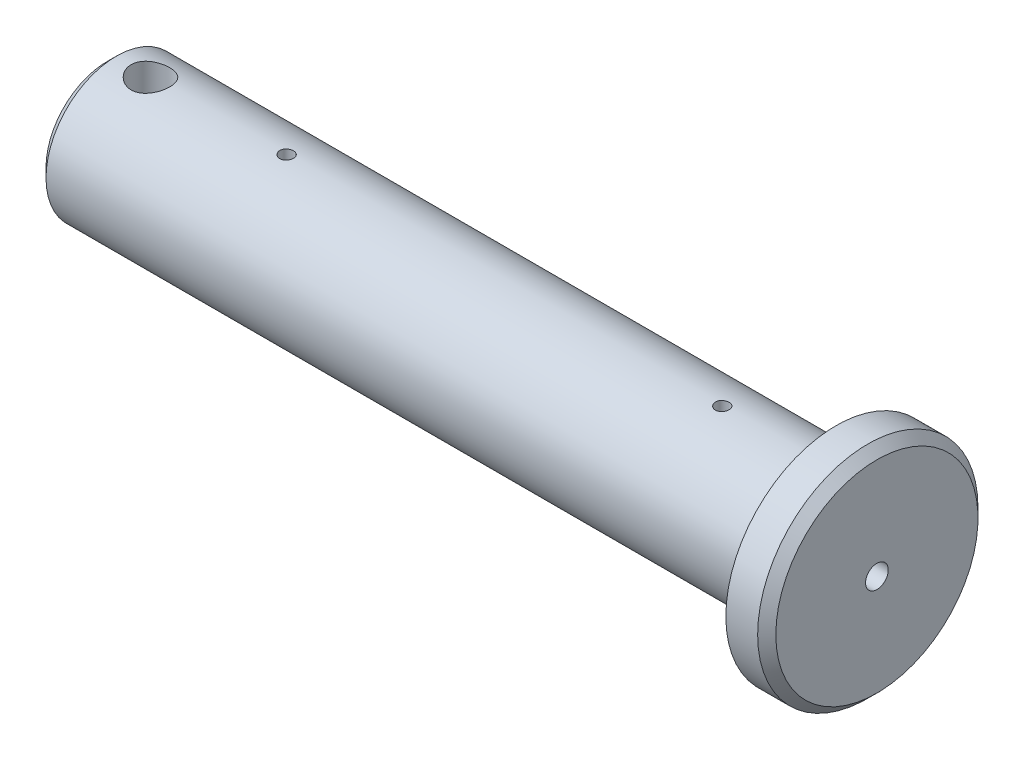
ISO-10303-21;
HEADER;
FILE_DESCRIPTION(('STEP AP214'),'2;1');
FILE_NAME('part.step','',(''),(''),'','','');
FILE_SCHEMA(('AUTOMOTIVE_DESIGN { 1 0 10303 214 1 1 1 1 }'));
ENDSEC;
DATA;
#1=APPLICATION_CONTEXT('core data for automotive mechanical design processes');
#2=APPLICATION_PROTOCOL_DEFINITION('international standard','automotive_design',2000,#1);
#3=PRODUCT_CONTEXT('',#1,'mechanical');
#4=PRODUCT('Part','Part','',(#3));
#5=PRODUCT_RELATED_PRODUCT_CATEGORY('part','',(#4));
#6=PRODUCT_DEFINITION_FORMATION('','',#4);
#7=PRODUCT_DEFINITION_CONTEXT('part definition',#1,'design');
#8=PRODUCT_DEFINITION('design','',#6,#7);
#9=PRODUCT_DEFINITION_SHAPE('','',#8);
#10=(LENGTH_UNIT() NAMED_UNIT(*) SI_UNIT(.MILLI.,.METRE.));
#11=(NAMED_UNIT(*) PLANE_ANGLE_UNIT() SI_UNIT($,.RADIAN.));
#12=(NAMED_UNIT(*) SI_UNIT($,.STERADIAN.) SOLID_ANGLE_UNIT());
#13=UNCERTAINTY_MEASURE_WITH_UNIT(LENGTH_MEASURE(1.E-05),#10,'distance_accuracy_value','');
#14=(GEOMETRIC_REPRESENTATION_CONTEXT(3) GLOBAL_UNCERTAINTY_ASSIGNED_CONTEXT((#13)) GLOBAL_UNIT_ASSIGNED_CONTEXT((#10,
#11,#12)) REPRESENTATION_CONTEXT('',''));
#15=CARTESIAN_POINT('',(0.,0.,0.));
#16=DIRECTION('',(0.,0.,1.));
#17=DIRECTION('',(1.,0.,0.));
#18=AXIS2_PLACEMENT_3D('',#15,#16,#17);
#19=CARTESIAN_POINT('',(-84.69,0.,0.));
#20=DIRECTION('',(-1.,0.,0.));
#21=DIRECTION('',(0.,0.,1.));
#22=AXIS2_PLACEMENT_3D('',#19,#20,#21);
#23=CYLINDRICAL_SURFACE('',#22,1.49999999999999);
#24=CARTESIAN_POINT('',(-45.22,0.,0.));
#25=DIRECTION('',(-0.707106781186547,-0.707106781186547,0.));
#26=DIRECTION('',(-0.707106781186547,0.707106781186547,0.));
#27=AXIS2_PLACEMENT_3D('',#24,#25,#26);
#28=ELLIPSE('',#27,2.12132034355964,1.5);
#29=CARTESIAN_POINT('',(-45.22,0.,1.49999999999999));
#30=VERTEX_POINT('',#29);
#31=CARTESIAN_POINT('',(-45.22,0.,-1.49999999999999));
#32=VERTEX_POINT('',#31);
#33=EDGE_CURVE('E71',#30,#32,#28,.T.);
#34=ORIENTED_EDGE('',*,*,#33,.F.);
#35=CARTESIAN_POINT('',(-45.22,0.,0.));
#36=DIRECTION('',(-0.707106781186547,0.707106781186547,0.));
#37=DIRECTION('',(-0.707106781186547,-0.707106781186547,0.));
#38=AXIS2_PLACEMENT_3D('',#35,#36,#37);
#39=ELLIPSE('',#38,2.12132034355964,1.5);
#40=EDGE_CURVE('E79',#32,#30,#39,.F.);
#41=ORIENTED_EDGE('',*,*,#40,.F.);
#42=EDGE_LOOP('',(#34,#41));
#43=FACE_BOUND('',#42,.T.);
#44=CARTESIAN_POINT('',(74.0891393809725,0.,0.));
#45=DIRECTION('',(-1.,0.,0.));
#46=DIRECTION('',(0.,0.,1.));
#47=AXIS2_PLACEMENT_3D('',#44,#45,#46);
#48=CIRCLE('',#47,1.5);
#49=CARTESIAN_POINT('',(74.0891393809725,0.,1.5));
#50=VERTEX_POINT('',#49);
#51=EDGE_CURVE('E57',#50,#50,#48,.T.);
#52=ORIENTED_EDGE('',*,*,#51,.F.);
#53=EDGE_LOOP('',(#52));
#54=FACE_BOUND('',#53,.T.);
#55=CARTESIAN_POINT('',(-50.7887090714587,0.,0.));
#56=DIRECTION('',(-1.,0.,0.));
#57=DIRECTION('',(0.,0.,1.));
#58=AXIS2_PLACEMENT_3D('',#55,#56,#57);
#59=CIRCLE('',#58,1.49999999999998);
#60=CARTESIAN_POINT('',(-50.7887090714587,0.,1.49999999999998));
#61=VERTEX_POINT('',#60);
#62=EDGE_CURVE('E11',#61,#61,#59,.T.);
#63=ORIENTED_EDGE('',*,*,#62,.T.);
#64=EDGE_LOOP('',(#63));
#65=FACE_BOUND('',#64,.T.);
#66=CARTESIAN_POINT('',(50.66,0.,0.));
#67=DIRECTION('',(-0.707106781186547,-0.707106781186547,0.));
#68=DIRECTION('',(-0.707106781186547,0.707106781186547,0.));
#69=AXIS2_PLACEMENT_3D('',#66,#67,#68);
#70=ELLIPSE('',#69,2.12132034355964,1.5);
#71=CARTESIAN_POINT('',(50.66,0.,1.49999999999999));
#72=VERTEX_POINT('',#71);
#73=CARTESIAN_POINT('',(50.66,0.,-1.49999999999999));
#74=VERTEX_POINT('',#73);
#75=EDGE_CURVE('E64',#72,#74,#70,.T.);
#76=ORIENTED_EDGE('',*,*,#75,.F.);
#77=CARTESIAN_POINT('',(50.66,0.,0.));
#78=DIRECTION('',(-0.707106781186547,0.707106781186547,0.));
#79=DIRECTION('',(-0.707106781186547,-0.707106781186547,0.));
#80=AXIS2_PLACEMENT_3D('',#77,#78,#79);
#81=ELLIPSE('',#80,2.12132034355964,1.5);
#82=EDGE_CURVE('E88',#74,#72,#81,.F.);
#83=ORIENTED_EDGE('',*,*,#82,.F.);
#84=EDGE_LOOP('',(#76,#83));
#85=FACE_BOUND('',#84,.T.);
#86=ADVANCED_FACE('F43',(#43,#54,#65,#85),#23,.F.);
#87=CARTESIAN_POINT('',(-84.69,0.,0.));
#88=DIRECTION('',(-1.,0.,0.));
#89=DIRECTION('',(0.,0.,1.));
#90=AXIS2_PLACEMENT_3D('',#87,#88,#89);
#91=CYLINDRICAL_SURFACE('',#90,15.5);
#92=CARTESIAN_POINT('',(-75.19,-14.9059551857638,4.25000000000001));
#93=CARTESIAN_POINT('',(-74.9561425685737,-14.9059589746067,4.24999488522443));
#94=CARTESIAN_POINT('',(-74.7222320276617,-14.9115188036944,4.23063214644481));
#95=CARTESIAN_POINT('',(-74.2611843252749,-14.9330861659049,4.15385079292532));
#96=CARTESIAN_POINT('',(-74.034050361403,-14.9490985521307,4.09641450051364));
#97=CARTESIAN_POINT('',(-73.5932927776466,-14.9896241970183,3.94553055670863));
#98=CARTESIAN_POINT('',(-73.3796499481119,-15.014125031094,3.85213551620893));
#99=CARTESIAN_POINT('',(-72.9710273981969,-15.0688509028496,3.6321519553497));
#100=CARTESIAN_POINT('',(-72.7760494313701,-15.0990764775727,3.50556032035812));
#101=CARTESIAN_POINT('',(-72.4051362387553,-15.1627418652733,3.21919692306056));
#102=CARTESIAN_POINT('',(-72.2297675853123,-15.1962412382274,3.05870439202163));
#103=CARTESIAN_POINT('',(-71.9080677612998,-15.2621667890378,2.71064396300684));
#104=CARTESIAN_POINT('',(-71.7617397483361,-15.2945928498733,2.52307312461682));
#105=CARTESIAN_POINT('',(-71.4998913025484,-15.3553854582037,2.12222978962299));
#106=CARTESIAN_POINT('',(-71.3849372578438,-15.3836735693965,1.9085743727651));
#107=CARTESIAN_POINT('',(-71.1927989655239,-15.4323177349871,1.46406257328755));
#108=CARTESIAN_POINT('',(-71.115607969622,-15.452675206464,1.23320927244565));
#109=CARTESIAN_POINT('',(-71.003029534185,-15.4827431563298,0.766771757966202));
#110=CARTESIAN_POINT('',(-70.9666775785766,-15.4926988815174,0.531436426250146));
#111=CARTESIAN_POINT('',(-70.9337712804948,-15.5017004118799,0.0578109376308894));
#112=CARTESIAN_POINT('',(-70.9372099105527,-15.5007481435306,-0.180478690084372));
#113=CARTESIAN_POINT('',(-70.9831148124032,-15.4882193102902,-0.646523777582157));
#114=CARTESIAN_POINT('',(-71.0245385137781,-15.4769265705426,-0.874390731987508));
#115=CARTESIAN_POINT('',(-71.1435493463301,-15.4453227170116,-1.31980593378543));
#116=CARTESIAN_POINT('',(-71.2211385966859,-15.4250110747544,-1.53735357567812));
#117=CARTESIAN_POINT('',(-71.4110565745773,-15.3772368866856,-1.95857637040681));
#118=CARTESIAN_POINT('',(-71.523736087884,-15.3497025975388,-2.16208489172741));
#119=CARTESIAN_POINT('',(-71.7803651564166,-15.2904400787306,-2.54765573900489));
#120=CARTESIAN_POINT('',(-71.9243211055055,-15.2587109920439,-2.72971366804827));
#121=CARTESIAN_POINT('',(-72.2449244246596,-15.1932749745251,-3.07343931000042));
#122=CARTESIAN_POINT('',(-72.4224800354133,-15.1595372699986,-3.23425504529121));
#123=CARTESIAN_POINT('',(-72.8023857546962,-15.0948080169217,-3.52404291190807));
#124=CARTESIAN_POINT('',(-73.0047375580112,-15.0638166563299,-3.65301286479991));
#125=CARTESIAN_POINT('',(-73.430423427954,-15.0079600434263,-3.87614695434802));
#126=CARTESIAN_POINT('',(-73.653891594839,-14.9831381611681,-3.97006688744779));
#127=CARTESIAN_POINT('',(-74.1142991756873,-14.9429632788265,-4.11871871775668));
#128=CARTESIAN_POINT('',(-74.3512350094966,-14.9276077750034,-4.17346097759179));
#129=CARTESIAN_POINT('',(-74.823853307174,-14.9086412339289,-4.24070836537975));
#130=CARTESIAN_POINT('',(-75.0593401472162,-14.9046754782246,-4.2544896602924));
#131=CARTESIAN_POINT('',(-75.5292560465583,-14.9079646659928,-4.24295040309155));
#132=CARTESIAN_POINT('',(-75.7636852227934,-14.9152183369659,-4.21763428537876));
#133=CARTESIAN_POINT('',(-76.2198283303444,-14.9397852018905,-4.12974654456128));
#134=CARTESIAN_POINT('',(-76.44170475715,-14.9568879428801,-4.06795367751815));
#135=CARTESIAN_POINT('',(-76.8719408324438,-14.9990175933463,-3.90974796893046));
#136=CARTESIAN_POINT('',(-77.0802986376794,-15.0240455806992,-3.81333041800276));
#137=CARTESIAN_POINT('',(-77.4828900510291,-15.0799249947055,-3.58605876975781));
#138=CARTESIAN_POINT('',(-77.676687033127,-15.1108974254731,-3.45446167916887));
#139=CARTESIAN_POINT('',(-78.0399157488401,-15.1748967565304,-3.16147897621475));
#140=CARTESIAN_POINT('',(-78.2093426185513,-15.2079240650634,-3.00008743196617));
#141=CARTESIAN_POINT('',(-78.5243801839865,-15.2735419232601,-2.64617301921005));
#142=CARTESIAN_POINT('',(-78.6690976488661,-15.3060877641918,-2.45284504731041));
#143=CARTESIAN_POINT('',(-78.9240321586473,-15.3660370665979,-2.04390471018055));
#144=CARTESIAN_POINT('',(-79.0342510374639,-15.3934408013913,-1.82829353031725));
#145=CARTESIAN_POINT('',(-79.2160288888176,-15.4398416416358,-1.38242251921242));
#146=CARTESIAN_POINT('',(-79.2878791468457,-15.4589018834113,-1.15228833379477));
#147=CARTESIAN_POINT('',(-79.3917084949337,-15.4867465190554,-0.682608118597718));
#148=CARTESIAN_POINT('',(-79.4236969670676,-15.4955333309008,-0.443064317210369));
#149=CARTESIAN_POINT('',(-79.4462791558743,-15.5017196678931,0.0303110813249502));
#150=CARTESIAN_POINT('',(-79.4381796490136,-15.4994786878096,0.264076498197157));
#151=CARTESIAN_POINT('',(-79.3838693918906,-15.4846816527614,0.726785748202853));
#152=CARTESIAN_POINT('',(-79.3376602212142,-15.4721260253226,0.955729780771838));
#153=CARTESIAN_POINT('',(-79.2091977944424,-15.4381889050738,1.40063034563142));
#154=CARTESIAN_POINT('',(-79.1272230594416,-15.4168756844443,1.61667285445488));
#155=CARTESIAN_POINT('',(-78.9298043886581,-15.3676455958708,2.03205974292101));
#156=CARTESIAN_POINT('',(-78.814355558461,-15.3397277623435,2.23140167519126));
#157=CARTESIAN_POINT('',(-78.5495167015816,-15.2792934706519,2.61375767900484));
#158=CARTESIAN_POINT('',(-78.399270066712,-15.2466704959798,2.79616151720711));
#159=CARTESIAN_POINT('',(-78.0707071847019,-15.180912762456,3.13360889027573));
#160=CARTESIAN_POINT('',(-77.892383420301,-15.1477778686939,3.28864507418654));
#161=CARTESIAN_POINT('',(-77.5076626578839,-15.0838420957925,3.5705945393854));
#162=CARTESIAN_POINT('',(-77.3007020291748,-15.0531148378429,3.69675701088007));
#163=CARTESIAN_POINT('',(-76.8676898453251,-14.9985392398652,3.9123222426296));
#164=CARTESIAN_POINT('',(-76.6416501962378,-14.9746866502117,4.00174772672291));
#165=CARTESIAN_POINT('',(-76.2122248559673,-14.9396718733312,4.130366453834));
#166=CARTESIAN_POINT('',(-76.0106003557514,-14.9271339479147,4.17511996078346));
#167=CARTESIAN_POINT('',(-75.6026639463207,-14.910274465581,4.23493706424275));
#168=CARTESIAN_POINT('',(-75.3963526488424,-14.9059518425399,4.25000451320911));
#169=CARTESIAN_POINT('',(-75.19,-14.9059551857638,4.25000000000001));
#170=B_SPLINE_CURVE_WITH_KNOTS('',3,(#92,#93,#94,#95,#96,#97,#98,#99,#100,#101,#102,#103,#104,
#105,#106,#107,#108,#109,#110,#111,#112,#113,#114,#115,#116,#117,#118,#119,#120,#121,#122,#123,
#124,#125,#126,#127,#128,#129,#130,#131,#132,#133,#134,#135,#136,#137,#138,#139,#140,#141,#142,
#143,#144,#145,#146,#147,#148,#149,#150,#151,#152,#153,#154,#155,#156,#157,#158,#159,#160,#161,
#162,#163,#164,#165,#166,#167,#168,#169),.UNSPECIFIED.,.T.,.F.,(4,2,2,2,2,2,2,2,2,2,2,2,2,2,2,2,
2,2,2,2,2,2,2,2,2,2,2,2,2,2,2,2,2,2,2,2,2,2,4),(0.,0.700813005442095,1.40195162871364,
2.10206829737107,2.80225067718094,3.51916932831063,4.2361658877673,4.96535881153612,
5.6944213803148,6.40587747651871,7.11720792342215,7.80958065973359,8.5019939718419,
9.20156422715699,9.90127763088445,10.6236664765061,11.3461047239884,12.0734863818195,
12.8006755735845,13.5049580187297,14.2091605905273,14.8988464856265,15.5886262220461,
16.2943159100148,17.0001462480639,17.7276948828281,18.4552048351627,19.1771102232133,
19.8988456678026,20.5972121802511,21.2955497479553,21.98854352139,22.6816386720414,
23.3940589625466,24.1066703190278,24.8361145903639,25.5651069786263,26.183575204833,
26.8019631651136),.UNSPECIFIED.);
#171=CARTESIAN_POINT('',(-75.19,-14.9059551857638,4.25000000000001));
#172=VERTEX_POINT('',#171);
#173=EDGE_CURVE('E47',#172,#172,#170,.T.);
#174=ORIENTED_EDGE('',*,*,#173,.T.);
#175=EDGE_LOOP('',(#174));
#176=FACE_BOUND('',#175,.T.);
#177=CARTESIAN_POINT('',(-75.19,14.9059551857638,4.25000000000001));
#178=CARTESIAN_POINT('',(-75.4238574314264,14.9059589746067,4.24999488522443));
#179=CARTESIAN_POINT('',(-75.6577679723383,14.9115188036944,4.23063214644481));
#180=CARTESIAN_POINT('',(-76.1188156747251,14.9330861659049,4.15385079292532));
#181=CARTESIAN_POINT('',(-76.345949638597,14.9490985521307,4.09641450051364));
#182=CARTESIAN_POINT('',(-76.7867072223534,14.9896241970183,3.94553055670863));
#183=CARTESIAN_POINT('',(-77.0003500518882,15.014125031094,3.85213551620893));
#184=CARTESIAN_POINT('',(-77.4089726018032,15.0688509028496,3.6321519553497));
#185=CARTESIAN_POINT('',(-77.6039505686299,15.0990764775727,3.50556032035812));
#186=CARTESIAN_POINT('',(-77.9748637612447,15.1627418652733,3.21919692306056));
#187=CARTESIAN_POINT('',(-78.1502324146877,15.1962412382274,3.05870439202163));
#188=CARTESIAN_POINT('',(-78.4719322387002,15.2621667890378,2.71064396300684));
#189=CARTESIAN_POINT('',(-78.618260251664,15.2945928498733,2.52307312461682));
#190=CARTESIAN_POINT('',(-78.8801086974516,15.3553854582037,2.12222978962299));
#191=CARTESIAN_POINT('',(-78.9950627421562,15.3836735693965,1.9085743727651));
#192=CARTESIAN_POINT('',(-79.1872010344762,15.4323177349871,1.46406257328755));
#193=CARTESIAN_POINT('',(-79.264392030378,15.452675206464,1.23320927244565));
#194=CARTESIAN_POINT('',(-79.376970465815,15.4827431563298,0.766771757966203));
#195=CARTESIAN_POINT('',(-79.4133224214235,15.4926988815174,0.531436426250147));
#196=CARTESIAN_POINT('',(-79.4462287195052,15.5017004118799,0.05781093763089));
#197=CARTESIAN_POINT('',(-79.4427900894473,15.5007481435306,-0.180478690084371));
#198=CARTESIAN_POINT('',(-79.3968851875969,15.4882193102902,-0.646523777582157));
#199=CARTESIAN_POINT('',(-79.355461486222,15.4769265705426,-0.874390731987508));
#200=CARTESIAN_POINT('',(-79.2364506536699,15.4453227170116,-1.31980593378543));
#201=CARTESIAN_POINT('',(-79.1588614033142,15.4250110747544,-1.53735357567812));
#202=CARTESIAN_POINT('',(-78.9689434254227,15.3772368866856,-1.95857637040681));
#203=CARTESIAN_POINT('',(-78.8562639121161,15.3497025975388,-2.16208489172742));
#204=CARTESIAN_POINT('',(-78.5996348435834,15.2904400787306,-2.54765573900489));
#205=CARTESIAN_POINT('',(-78.4556788944945,15.2587109920439,-2.72971366804827));
#206=CARTESIAN_POINT('',(-78.1350755753405,15.1932749745251,-3.07343931000042));
#207=CARTESIAN_POINT('',(-77.9575199645867,15.1595372699986,-3.2342550452912));
#208=CARTESIAN_POINT('',(-77.5776142453039,15.0948080169217,-3.52404291190806));
#209=CARTESIAN_POINT('',(-77.3752624419889,15.0638166563299,-3.6530128647999));
#210=CARTESIAN_POINT('',(-76.9495765720461,15.0079600434263,-3.87614695434802));
#211=CARTESIAN_POINT('',(-76.7261084051611,14.9831381611681,-3.97006688744778));
#212=CARTESIAN_POINT('',(-76.2657008243127,14.9429632788265,-4.11871871775667));
#213=CARTESIAN_POINT('',(-76.0287649905035,14.9276077750034,-4.17346097759179));
#214=CARTESIAN_POINT('',(-75.556146692826,14.9086412339289,-4.24070836537975));
#215=CARTESIAN_POINT('',(-75.3206598527839,14.9046754782246,-4.2544896602924));
#216=CARTESIAN_POINT('',(-74.8507439534417,14.9079646659928,-4.24295040309155));
#217=CARTESIAN_POINT('',(-74.6163147772067,14.9152183369659,-4.21763428537876));
#218=CARTESIAN_POINT('',(-74.1601716696556,14.9397852018905,-4.12974654456128));
#219=CARTESIAN_POINT('',(-73.9382952428501,14.9568879428801,-4.06795367751815));
#220=CARTESIAN_POINT('',(-73.5080591675563,14.9990175933463,-3.90974796893046));
#221=CARTESIAN_POINT('',(-73.2997013623206,15.0240455806992,-3.81333041800276));
#222=CARTESIAN_POINT('',(-72.897109948971,15.0799249947055,-3.58605876975781));
#223=CARTESIAN_POINT('',(-72.7033129668731,15.1108974254731,-3.45446167916887));
#224=CARTESIAN_POINT('',(-72.34008425116,15.1748967565304,-3.16147897621475));
#225=CARTESIAN_POINT('',(-72.1706573814487,15.2079240650634,-3.00008743196617));
#226=CARTESIAN_POINT('',(-71.8556198160135,15.2735419232601,-2.64617301921005));
#227=CARTESIAN_POINT('',(-71.7109023511339,15.3060877641918,-2.45284504731041));
#228=CARTESIAN_POINT('',(-71.4559678413528,15.3660370665979,-2.04390471018055));
#229=CARTESIAN_POINT('',(-71.3457489625361,15.3934408013913,-1.82829353031725));
#230=CARTESIAN_POINT('',(-71.1639711111824,15.4398416416358,-1.38242251921242));
#231=CARTESIAN_POINT('',(-71.0921208531543,15.4589018834113,-1.15228833379477));
#232=CARTESIAN_POINT('',(-70.9882915050664,15.4867465190554,-0.682608118597718));
#233=CARTESIAN_POINT('',(-70.9563030329325,15.4955333309008,-0.443064317210369));
#234=CARTESIAN_POINT('',(-70.9337208441257,15.5017196678931,0.0303110813249502));
#235=CARTESIAN_POINT('',(-70.9418203509865,15.4994786878096,0.264076498197157));
#236=CARTESIAN_POINT('',(-70.9961306081095,15.4846816527614,0.726785748202853));
#237=CARTESIAN_POINT('',(-71.0423397787858,15.4721260253226,0.955729780771838));
#238=CARTESIAN_POINT('',(-71.1708022055576,15.4381889050738,1.40063034563142));
#239=CARTESIAN_POINT('',(-71.2527769405584,15.4168756844443,1.61667285445488));
#240=CARTESIAN_POINT('',(-71.4501956113419,15.3676455958708,2.03205974292101));
#241=CARTESIAN_POINT('',(-71.5656444415391,15.3397277623435,2.23140167519126));
#242=CARTESIAN_POINT('',(-71.8304832984184,15.2792934706519,2.61375767900484));
#243=CARTESIAN_POINT('',(-71.980729933288,15.2466704959798,2.79616151720711));
#244=CARTESIAN_POINT('',(-72.3092928152981,15.180912762456,3.13360889027573));
#245=CARTESIAN_POINT('',(-72.487616579699,15.1477778686939,3.28864507418654));
#246=CARTESIAN_POINT('',(-72.8723373421162,15.0838420957925,3.5705945393854));
#247=CARTESIAN_POINT('',(-73.0792979708252,15.0531148378429,3.69675701088007));
#248=CARTESIAN_POINT('',(-73.512310154675,14.9985392398652,3.9123222426296));
#249=CARTESIAN_POINT('',(-73.7383498037622,14.9746866502117,4.00174772672291));
#250=CARTESIAN_POINT('',(-74.1677751440327,14.9396718733312,4.130366453834));
#251=CARTESIAN_POINT('',(-74.3693996442487,14.9271339479147,4.17511996078345));
#252=CARTESIAN_POINT('',(-74.7773360536793,14.910274465581,4.23493706424274));
#253=CARTESIAN_POINT('',(-74.9836473511576,14.9059518425399,4.25000451320911));
#254=CARTESIAN_POINT('',(-75.19,14.9059551857638,4.25000000000001));
#255=B_SPLINE_CURVE_WITH_KNOTS('',3,(#177,#178,#179,#180,#181,#182,#183,#184,#185,#186,#187,
#188,#189,#190,#191,#192,#193,#194,#195,#196,#197,#198,#199,#200,#201,#202,#203,#204,#205,#206,
#207,#208,#209,#210,#211,#212,#213,#214,#215,#216,#217,#218,#219,#220,#221,#222,#223,#224,#225,
#226,#227,#228,#229,#230,#231,#232,#233,#234,#235,#236,#237,#238,#239,#240,#241,#242,#243,#244,
#245,#246,#247,#248,#249,#250,#251,#252,#253,#254),.UNSPECIFIED.,.T.,.F.,(4,2,2,2,2,2,2,2,2,2,2,
2,2,2,2,2,2,2,2,2,2,2,2,2,2,2,2,2,2,2,2,2,2,2,2,2,2,2,4),(0.,0.700813005442095,1.40195162871364,
2.10206829737107,2.80225067718094,3.51916932831063,4.2361658877673,4.96535881153612,
5.6944213803148,6.40587747651871,7.11720792342215,7.80958065973359,8.5019939718419,
9.20156422715699,9.90127763088445,10.6236664765061,11.3461047239884,12.0734863818195,
12.8006755735845,13.5049580187297,14.2091605905273,14.8988464856265,15.5886262220461,
16.2943159100148,17.0001462480639,17.7276948828281,18.4552048351627,19.1771102232133,
19.8988456678026,20.5972121802511,21.2955497479553,21.98854352139,22.6816386720414,
23.3940589625466,24.1066703190278,24.8361145903639,25.5651069786263,26.183575204833,
26.8019631651136),.UNSPECIFIED.);
#256=CARTESIAN_POINT('',(-75.19,14.9059551857638,4.25000000000001));
#257=VERTEX_POINT('',#256);
#258=EDGE_CURVE('E207',#257,#257,#255,.T.);
#259=ORIENTED_EDGE('',*,*,#258,.T.);
#260=EDGE_LOOP('',(#259));
#261=FACE_BOUND('',#260,.T.);
#262=CARTESIAN_POINT('',(-82.69,0.,0.));
#263=DIRECTION('',(-1.,0.,0.));
#264=DIRECTION('',(0.,0.,1.));
#265=AXIS2_PLACEMENT_3D('',#262,#263,#264);
#266=CIRCLE('',#265,15.5);
#267=CARTESIAN_POINT('',(-82.69,0.,15.5));
#268=VERTEX_POINT('',#267);
#269=EDGE_CURVE('E96',#268,#268,#266,.T.);
#270=ORIENTED_EDGE('',*,*,#269,.F.);
#271=EDGE_LOOP('',(#270));
#272=FACE_BOUND('',#271,.T.);
#273=CARTESIAN_POINT('',(75.69,0.,0.));
#274=DIRECTION('',(-1.,0.,0.));
#275=DIRECTION('',(0.,0.,1.));
#276=AXIS2_PLACEMENT_3D('',#273,#274,#275);
#277=CIRCLE('',#276,15.5);
#278=CARTESIAN_POINT('',(75.69,0.,15.5));
#279=VERTEX_POINT('',#278);
#280=EDGE_CURVE('E99',#279,#279,#277,.T.);
#281=ORIENTED_EDGE('',*,*,#280,.T.);
#282=EDGE_LOOP('',(#281));
#283=FACE_BOUND('',#282,.T.);
#284=CARTESIAN_POINT('',(-45.22,15.4272486205415,-1.5));
#285=CARTESIAN_POINT('',(-45.3040437300731,15.4272495762053,-1.49999635273367));
#286=CARTESIAN_POINT('',(-45.3881433720592,15.4279427937306,-1.49291286811258));
#287=CARTESIAN_POINT('',(-45.5540119532648,15.430640453035,-1.46476190343446));
#288=CARTESIAN_POINT('',(-45.6357782040165,15.4326463482579,-1.4436789222522));
#289=CARTESIAN_POINT('',(-45.7945538949481,15.437740070862,-1.38814775669282));
#290=CARTESIAN_POINT('',(-45.8715661481888,15.4408272510593,-1.35370756571673));
#291=CARTESIAN_POINT('',(-46.0186998857381,15.4477348969845,-1.27245473516317));
#292=CARTESIAN_POINT('',(-46.0888227563866,15.4515552147255,-1.22564459179643));
#293=CARTESIAN_POINT('',(-46.2204436163967,15.4595132994192,-1.12080875101044));
#294=CARTESIAN_POINT('',(-46.2819147870709,15.4636519945188,-1.06274945008663));
#295=CARTESIAN_POINT('',(-46.3942564744044,15.4717720678067,-0.937135068924943));
#296=CARTESIAN_POINT('',(-46.4451265106473,15.4757534388588,-0.869579558575183));
#297=CARTESIAN_POINT('',(-46.5349139827561,15.4831193712265,-0.726726902551949));
#298=CARTESIAN_POINT('',(-46.5738077793397,15.4865027466554,-0.65141483248059));
#299=CARTESIAN_POINT('',(-46.638387494921,15.4922813908854,-0.495290605452276));
#300=CARTESIAN_POINT('',(-46.6640737169754,15.4946766823585,-0.414478574743815));
#301=CARTESIAN_POINT('',(-46.701430753443,15.4982027647793,-0.249918644261419));
#302=CARTESIAN_POINT('',(-46.7131454977945,15.4993375184079,-0.166180803353741));
#303=CARTESIAN_POINT('',(-46.7223629416129,15.5002281367855,0.00207964718939861));
#304=CARTESIAN_POINT('',(-46.719865987961,15.4999840351898,0.0866022376203045));
#305=CARTESIAN_POINT('',(-46.7007666308892,15.49814769549,0.253734755360418));
#306=CARTESIAN_POINT('',(-46.6842114658392,15.4965599722815,0.336350137444744));
#307=CARTESIAN_POINT('',(-46.6375391885325,15.4922200429903,0.497624182324234));
#308=CARTESIAN_POINT('',(-46.6074219097363,15.4894678226079,0.576282796518045));
#309=CARTESIAN_POINT('',(-46.5344283521634,15.4831006026184,0.727559671700198));
#310=CARTESIAN_POINT('',(-46.4915311173508,15.4794841878842,0.800167759083598));
#311=CARTESIAN_POINT('',(-46.3942105589952,15.471794498963,0.937171486028484));
#312=CARTESIAN_POINT('',(-46.3397869190245,15.4677212122353,1.00156690005453));
#313=CARTESIAN_POINT('',(-46.2206926504523,15.4595553186037,1.12059391195513));
#314=CARTESIAN_POINT('',(-46.1559809384033,15.4554627009385,1.17518441075973));
#315=CARTESIAN_POINT('',(-46.0182900466098,15.4477360955615,1.27273391927944));
#316=CARTESIAN_POINT('',(-45.945310856085,15.4441021084478,1.31569291382736));
#317=CARTESIAN_POINT('',(-45.7931255999824,15.4377038172581,1.38875948355566));
#318=CARTESIAN_POINT('',(-45.7139183484872,15.4349396793182,1.41886460411144));
#319=CARTESIAN_POINT('',(-45.5515405977482,15.4305974532704,1.46533676335695));
#320=CARTESIAN_POINT('',(-45.4683702115023,15.4290193313679,1.48170419349198));
#321=CARTESIAN_POINT('',(-45.3007876559758,15.427233596907,1.50018366727273));
#322=CARTESIAN_POINT('',(-45.2163818792272,15.4270204603027,1.50235317019412));
#323=CARTESIAN_POINT('',(-45.0484079526453,15.4279742507011,1.49252602553122));
#324=CARTESIAN_POINT('',(-44.9648397922382,15.4291411602604,1.48052955700142));
#325=CARTESIAN_POINT('',(-44.8010802517454,15.4327185338479,1.44275904299401));
#326=CARTESIAN_POINT('',(-44.7208825642072,15.4351265519335,1.41701209298938));
#327=CARTESIAN_POINT('',(-44.5659445656141,15.4409128261549,1.35249911505811));
#328=CARTESIAN_POINT('',(-44.491204371902,15.4442911031447,1.31373280729956));
#329=CARTESIAN_POINT('',(-44.3490408441439,15.4516506249983,1.22413730423843));
#330=CARTESIAN_POINT('',(-44.2816416339403,15.4556337606302,1.17326998871048));
#331=CARTESIAN_POINT('',(-44.156317752048,15.4637479703292,1.06097113074415));
#332=CARTESIAN_POINT('',(-44.098393300075,15.4678790478245,0.999539343387764));
#333=CARTESIAN_POINT('',(-43.9934654680511,15.4758403013341,0.867606294585207));
#334=CARTESIAN_POINT('',(-43.9464995406048,15.479669416663,0.797075173763887));
#335=CARTESIAN_POINT('',(-43.8650795158334,15.4865798986659,0.649093330751937));
#336=CARTESIAN_POINT('',(-43.830625256567,15.4896612750178,0.571642698138169));
#337=CARTESIAN_POINT('',(-43.7752702366564,15.494724282397,0.41215182585768));
#338=CARTESIAN_POINT('',(-43.754346743334,15.4967077571672,0.330119536999962));
#339=CARTESIAN_POINT('',(-43.7265729830339,15.4993590266409,0.163686026176501));
#340=CARTESIAN_POINT('',(-43.7197223474035,15.500026855809,0.0792848663244353));
#341=CARTESIAN_POINT('',(-43.7202937627329,15.4999715850939,-0.0891224076988859));
#342=CARTESIAN_POINT('',(-43.7276576256519,15.4992541558592,-0.173128727243041));
#343=CARTESIAN_POINT('',(-43.7563271283409,15.4965201712153,-0.338705098694834));
#344=CARTESIAN_POINT('',(-43.7776327809065,15.4945036146139,-0.420275148366415));
#345=CARTESIAN_POINT('',(-43.8335652191636,15.4893973785399,-0.578663911447218));
#346=CARTESIAN_POINT('',(-43.8681904340446,15.4863078256128,-0.655483183888337));
#347=CARTESIAN_POINT('',(-43.9497728385726,15.479400249659,-0.802228516090091));
#348=CARTESIAN_POINT('',(-43.9967299307677,15.4755822323889,-0.872154630317413));
#349=CARTESIAN_POINT('',(-44.1018614903022,15.4676269442836,-1.0034268733249));
#350=CARTESIAN_POINT('',(-44.1600792501062,15.4634884795258,-1.06473825878138));
#351=CARTESIAN_POINT('',(-44.2859953022832,15.4553688521359,-1.17674814744616));
#352=CARTESIAN_POINT('',(-44.3536958705027,15.4513877275599,-1.22744409567171));
#353=CARTESIAN_POINT('',(-44.4968320881815,15.4440232805444,-1.31687873837621));
#354=CARTESIAN_POINT('',(-44.572285922999,15.4406414166868,-1.35558842513088));
#355=CARTESIAN_POINT('',(-44.7286063696469,15.434875848275,-1.41973743997564));
#356=CARTESIAN_POINT('',(-44.809466733897,15.4324910139469,-1.44519179629026));
#357=CARTESIAN_POINT('',(-44.9456575144106,15.4295934282093,-1.47573184740526));
#358=CARTESIAN_POINT('',(-45.000116104751,15.4287182593573,-1.48482003833327));
#359=CARTESIAN_POINT('',(-45.1097084375171,15.4275455430393,-1.49695529980203));
#360=CARTESIAN_POINT('',(-45.1648421773318,15.4272479933402,-1.50000239369753));
#361=CARTESIAN_POINT('',(-45.22,15.4272486205415,-1.5));
#362=B_SPLINE_CURVE_WITH_KNOTS('',3,(#284,#285,#286,#287,#288,#289,#290,#291,#292,#293,#294,
#295,#296,#297,#298,#299,#300,#301,#302,#303,#304,#305,#306,#307,#308,#309,#310,#311,#312,#313,
#314,#315,#316,#317,#318,#319,#320,#321,#322,#323,#324,#325,#326,#327,#328,#329,#330,#331,#332,
#333,#334,#335,#336,#337,#338,#339,#340,#341,#342,#343,#344,#345,#346,#347,#348,#349,#350,#351,
#352,#353,#354,#355,#356,#357,#358,#359,#360,#361),.UNSPECIFIED.,.T.,.F.,(4,2,2,2,2,2,2,2,2,2,2,
2,2,2,2,2,2,2,2,2,2,2,2,2,2,2,2,2,2,2,2,2,2,2,2,2,2,2,4),(0.,0.251929770973533,
0.504138960670295,0.756197452261746,1.00820511817074,1.26097752306989,1.51376138048255,
1.76704104296288,2.02031489351108,2.27279026822666,2.52525948051238,2.77688368804001,
3.02851098553733,3.28055318345279,3.53260230143071,3.78568445188924,4.03876693235871,
4.29189772082747,4.54502129627715,4.79711983905144,5.04921519539427,5.3008156181168,
5.55242144896545,5.80483062864563,6.05724566076133,6.31051112512718,6.56377331130815,
6.81660888534425,7.06943783601312,7.32123400826627,7.57303041161587,7.82479712906295,
8.07656185700128,8.32931447537208,8.58212785790734,8.83554837189727,9.0886809415155,
9.25402285746395,9.41936413420286),.UNSPECIFIED.);
#363=CARTESIAN_POINT('',(-45.22,15.4272486205415,-1.5));
#364=VERTEX_POINT('',#363);
#365=EDGE_CURVE('E82',#364,#364,#362,.T.);
#366=ORIENTED_EDGE('',*,*,#365,.F.);
#367=EDGE_LOOP('',(#366));
#368=FACE_BOUND('',#367,.T.);
#369=CARTESIAN_POINT('',(50.66,15.4272486205415,-1.5));
#370=CARTESIAN_POINT('',(50.5759562699269,15.4272495762053,-1.49999635273367));
#371=CARTESIAN_POINT('',(50.4918566279408,15.4279427937306,-1.49291286811258));
#372=CARTESIAN_POINT('',(50.3259880467352,15.430640453035,-1.46476190343446));
#373=CARTESIAN_POINT('',(50.2442217959835,15.4326463482579,-1.4436789222522));
#374=CARTESIAN_POINT('',(50.0854461050519,15.437740070862,-1.38814775669282));
#375=CARTESIAN_POINT('',(50.0084338518112,15.4408272510593,-1.35370756571673));
#376=CARTESIAN_POINT('',(49.861300114262,15.4477348969845,-1.27245473516317));
#377=CARTESIAN_POINT('',(49.7911772436134,15.4515552147255,-1.22564459179643));
#378=CARTESIAN_POINT('',(49.6595563836033,15.4595132994192,-1.12080875101044));
#379=CARTESIAN_POINT('',(49.5980852129291,15.4636519945188,-1.06274945008663));
#380=CARTESIAN_POINT('',(49.4857435255956,15.4717720678067,-0.937135068924943));
#381=CARTESIAN_POINT('',(49.4348734893527,15.4757534388588,-0.869579558575183));
#382=CARTESIAN_POINT('',(49.3450860172439,15.4831193712265,-0.726726902551949));
#383=CARTESIAN_POINT('',(49.3061922206603,15.4865027466554,-0.651414832480589));
#384=CARTESIAN_POINT('',(49.241612505079,15.4922813908854,-0.495290605452276));
#385=CARTESIAN_POINT('',(49.2159262830246,15.4946766823585,-0.414478574743815));
#386=CARTESIAN_POINT('',(49.178569246557,15.4982027647793,-0.249918644261419));
#387=CARTESIAN_POINT('',(49.1668545022055,15.4993375184079,-0.166180803353741));
#388=CARTESIAN_POINT('',(49.1576370583871,15.5002281367855,0.00207964718939922));
#389=CARTESIAN_POINT('',(49.160134012039,15.4999840351898,0.0866022376203051));
#390=CARTESIAN_POINT('',(49.1792333691108,15.49814769549,0.25373475536042));
#391=CARTESIAN_POINT('',(49.1957885341608,15.4965599722815,0.336350137444746));
#392=CARTESIAN_POINT('',(49.2424608114675,15.4922200429903,0.497624182324236));
#393=CARTESIAN_POINT('',(49.2725780902637,15.4894678226079,0.576282796518046));
#394=CARTESIAN_POINT('',(49.3455716478366,15.4831006026184,0.727559671700198));
#395=CARTESIAN_POINT('',(49.3884688826491,15.4794841878842,0.800167759083599));
#396=CARTESIAN_POINT('',(49.4857894410048,15.471794498963,0.937171486028484));
#397=CARTESIAN_POINT('',(49.5402130809755,15.4677212122353,1.00156690005453));
#398=CARTESIAN_POINT('',(49.6593073495477,15.4595553186037,1.12059391195513));
#399=CARTESIAN_POINT('',(49.7240190615967,15.4554627009385,1.17518441075973));
#400=CARTESIAN_POINT('',(49.8617099533902,15.4477360955615,1.27273391927944));
#401=CARTESIAN_POINT('',(49.934689143915,15.4441021084478,1.31569291382736));
#402=CARTESIAN_POINT('',(50.0868744000176,15.4377038172581,1.38875948355566));
#403=CARTESIAN_POINT('',(50.1660816515128,15.4349396793182,1.41886460411144));
#404=CARTESIAN_POINT('',(50.3284594022518,15.4305974532704,1.46533676335695));
#405=CARTESIAN_POINT('',(50.4116297884977,15.4290193313679,1.48170419349198));
#406=CARTESIAN_POINT('',(50.5792123440242,15.427233596907,1.50018366727273));
#407=CARTESIAN_POINT('',(50.6636181207728,15.4270204603027,1.50235317019412));
#408=CARTESIAN_POINT('',(50.8315920473547,15.4279742507011,1.49252602553122));
#409=CARTESIAN_POINT('',(50.9151602077618,15.4291411602604,1.48052955700143));
#410=CARTESIAN_POINT('',(51.0789197482546,15.4327185338479,1.44275904299401));
#411=CARTESIAN_POINT('',(51.1591174357928,15.4351265519335,1.41701209298938));
#412=CARTESIAN_POINT('',(51.3140554343859,15.4409128261549,1.35249911505811));
#413=CARTESIAN_POINT('',(51.388795628098,15.4442911031447,1.31373280729956));
#414=CARTESIAN_POINT('',(51.5309591558561,15.4516506249983,1.22413730423843));
#415=CARTESIAN_POINT('',(51.5983583660597,15.4556337606302,1.17326998871048));
#416=CARTESIAN_POINT('',(51.7236822479521,15.4637479703292,1.06097113074415));
#417=CARTESIAN_POINT('',(51.781606699925,15.4678790478245,0.999539343387763));
#418=CARTESIAN_POINT('',(51.8865345319489,15.4758403013341,0.867606294585207));
#419=CARTESIAN_POINT('',(51.9335004593952,15.479669416663,0.797075173763886));
#420=CARTESIAN_POINT('',(52.0149204841666,15.4865798986659,0.649093330751936));
#421=CARTESIAN_POINT('',(52.049374743433,15.4896612750178,0.571642698138168));
#422=CARTESIAN_POINT('',(52.1047297633436,15.494724282397,0.412151825857681));
#423=CARTESIAN_POINT('',(52.125653256666,15.4967077571672,0.330119536999963));
#424=CARTESIAN_POINT('',(52.1534270169661,15.4993590266409,0.163686026176503));
#425=CARTESIAN_POINT('',(52.1602776525965,15.500026855809,0.0792848663244365));
#426=CARTESIAN_POINT('',(52.1597062372671,15.4999715850939,-0.0891224076988855));
#427=CARTESIAN_POINT('',(52.1523423743481,15.4992541558592,-0.17312872724304));
#428=CARTESIAN_POINT('',(52.1236728716591,15.4965201712153,-0.338705098694833));
#429=CARTESIAN_POINT('',(52.1023672190935,15.4945036146139,-0.420275148366414));
#430=CARTESIAN_POINT('',(52.0464347808364,15.4893973785399,-0.578663911447216));
#431=CARTESIAN_POINT('',(52.0118095659554,15.4863078256128,-0.655483183888334));
#432=CARTESIAN_POINT('',(51.9302271614274,15.479400249659,-0.802228516090088));
#433=CARTESIAN_POINT('',(51.8832700692323,15.4755822323889,-0.872154630317411));
#434=CARTESIAN_POINT('',(51.7781385096978,15.4676269442836,-1.0034268733249));
#435=CARTESIAN_POINT('',(51.7199207498938,15.4634884795258,-1.06473825878138));
#436=CARTESIAN_POINT('',(51.5940046977168,15.4553688521359,-1.17674814744616));
#437=CARTESIAN_POINT('',(51.5263041294973,15.4513877275599,-1.22744409567171));
#438=CARTESIAN_POINT('',(51.3831679118185,15.4440232805444,-1.31687873837621));
#439=CARTESIAN_POINT('',(51.307714077001,15.4406414166868,-1.35558842513088));
#440=CARTESIAN_POINT('',(51.1513936303531,15.434875848275,-1.41973743997564));
#441=CARTESIAN_POINT('',(51.070533266103,15.4324910139469,-1.44519179629026));
#442=CARTESIAN_POINT('',(50.9343424855894,15.4295934282093,-1.47573184740525));
#443=CARTESIAN_POINT('',(50.879883895249,15.4287182593573,-1.48482003833326));
#444=CARTESIAN_POINT('',(50.7702915624829,15.4275455430393,-1.49695529980203));
#445=CARTESIAN_POINT('',(50.7151578226682,15.4272479933402,-1.50000239369753));
#446=CARTESIAN_POINT('',(50.66,15.4272486205415,-1.5));
#447=B_SPLINE_CURVE_WITH_KNOTS('',3,(#369,#370,#371,#372,#373,#374,#375,#376,#377,#378,#379,
#380,#381,#382,#383,#384,#385,#386,#387,#388,#389,#390,#391,#392,#393,#394,#395,#396,#397,#398,
#399,#400,#401,#402,#403,#404,#405,#406,#407,#408,#409,#410,#411,#412,#413,#414,#415,#416,#417,
#418,#419,#420,#421,#422,#423,#424,#425,#426,#427,#428,#429,#430,#431,#432,#433,#434,#435,#436,
#437,#438,#439,#440,#441,#442,#443,#444,#445,#446),.UNSPECIFIED.,.T.,.F.,(4,2,2,2,2,2,2,2,2,2,2,
2,2,2,2,2,2,2,2,2,2,2,2,2,2,2,2,2,2,2,2,2,2,2,2,2,2,2,4),(0.,0.251929770973533,
0.504138960670295,0.756197452261739,1.00820511817073,1.26097752306989,1.51376138048255,
1.76704104296288,2.02031489351108,2.27279026822666,2.52525948051238,2.77688368804002,
3.02851098553733,3.28055318345279,3.53260230143071,3.78568445188924,4.03876693235871,
4.29189772082747,4.54502129627715,4.79711983905144,5.04921519539427,5.30081561811681,
5.55242144896545,5.80483062864564,6.05724566076133,6.31051112512719,6.56377331130815,
6.81660888534425,7.06943783601312,7.32123400826627,7.57303041161587,7.82479712906295,
8.07656185700128,8.32931447537207,8.58212785790735,8.83554837189728,9.08868094151551,
9.25402285746394,9.41936413420287),.UNSPECIFIED.);
#448=CARTESIAN_POINT('',(50.66,15.4272486205415,-1.5));
#449=VERTEX_POINT('',#448);
#450=EDGE_CURVE('E85',#449,#449,#447,.T.);
#451=ORIENTED_EDGE('',*,*,#450,.F.);
#452=EDGE_LOOP('',(#451));
#453=FACE_BOUND('',#452,.T.);
#454=ADVANCED_FACE('F128',(#176,#261,#272,#283,#368,#453),#91,.T.);
#455=CARTESIAN_POINT('',(-51.69,0.,0.));
#456=DIRECTION('',(1.,0.,0.));
#457=DIRECTION('',(0.,0.,-1.));
#458=AXIS2_PLACEMENT_3D('',#455,#456,#457);
#459=CONICAL_SURFACE('',#458,0.,1.02974425867666);
#460=ORIENTED_EDGE('',*,*,#62,.F.);
#461=EDGE_LOOP('',(#460));
#462=FACE_BOUND('',#461,.T.);
#463=CARTESIAN_POINT('',(-51.69,0.,0.));
#464=VERTEX_POINT('',#463);
#465=VERTEX_LOOP('',#464);
#466=FACE_BOUND('',#465,.T.);
#467=ADVANCED_FACE('F45',(#462,#466),#459,.F.);
#468=CARTESIAN_POINT('',(74.0891393809725,0.,0.));
#469=DIRECTION('',(1.,0.,0.));
#470=DIRECTION('',(0.,0.,-1.));
#471=AXIS2_PLACEMENT_3D('',#468,#469,#470);
#472=CONICAL_SURFACE('',#471,1.5,1.02974425867667);
#473=CARTESIAN_POINT('',(74.69,0.,0.));
#474=DIRECTION('',(-1.,0.,0.));
#475=DIRECTION('',(0.,0.,1.));
#476=AXIS2_PLACEMENT_3D('',#473,#474,#475);
#477=CIRCLE('',#476,2.5);
#478=CARTESIAN_POINT('',(74.69,0.,2.5));
#479=VERTEX_POINT('',#478);
#480=EDGE_CURVE('E114',#479,#479,#477,.T.);
#481=ORIENTED_EDGE('',*,*,#480,.F.);
#482=EDGE_LOOP('',(#481));
#483=FACE_BOUND('',#482,.T.);
#484=ORIENTED_EDGE('',*,*,#51,.T.);
#485=EDGE_LOOP('',(#484));
#486=FACE_BOUND('',#485,.T.);
#487=ADVANCED_FACE('F158',(#483,#486),#472,.F.);
#488=CARTESIAN_POINT('',(-84.69,0.,0.));
#489=DIRECTION('',(-1.,0.,0.));
#490=DIRECTION('',(0.,0.,1.));
#491=AXIS2_PLACEMENT_3D('',#488,#489,#490);
#492=CYLINDRICAL_SURFACE('',#491,2.5);
#493=CARTESIAN_POINT('',(84.69,0.,0.));
#494=DIRECTION('',(-1.,0.,0.));
#495=DIRECTION('',(0.,0.,1.));
#496=AXIS2_PLACEMENT_3D('',#493,#494,#495);
#497=CIRCLE('',#496,2.5);
#498=CARTESIAN_POINT('',(84.69,0.,2.5));
#499=VERTEX_POINT('',#498);
#500=EDGE_CURVE('E111',#499,#499,#497,.T.);
#501=ORIENTED_EDGE('',*,*,#500,.F.);
#502=EDGE_LOOP('',(#501));
#503=FACE_BOUND('',#502,.T.);
#504=ORIENTED_EDGE('',*,*,#480,.T.);
#505=EDGE_LOOP('',(#504));
#506=FACE_BOUND('',#505,.T.);
#507=ADVANCED_FACE('F161',(#503,#506),#492,.F.);
#508=CARTESIAN_POINT('',(84.69,2.5,0.));
#509=DIRECTION('',(-1.,0.,0.));
#510=DIRECTION('',(0.,0.,1.));
#511=AXIS2_PLACEMENT_3D('',#508,#509,#510);
#512=PLANE('',#511);
#513=CARTESIAN_POINT('',(84.69,0.,0.));
#514=DIRECTION('',(-1.,0.,0.));
#515=DIRECTION('',(0.,0.,1.));
#516=AXIS2_PLACEMENT_3D('',#513,#514,#515);
#517=CIRCLE('',#516,22.25);
#518=CARTESIAN_POINT('',(84.69,0.,22.25));
#519=VERTEX_POINT('',#518);
#520=EDGE_CURVE('E108',#519,#519,#517,.T.);
#521=ORIENTED_EDGE('',*,*,#520,.F.);
#522=EDGE_LOOP('',(#521));
#523=FACE_BOUND('',#522,.T.);
#524=ORIENTED_EDGE('',*,*,#500,.T.);
#525=EDGE_LOOP('',(#524));
#526=FACE_BOUND('',#525,.T.);
#527=ADVANCED_FACE('F165',(#523,#526),#512,.F.);
#528=CARTESIAN_POINT('',(84.69,0.,0.));
#529=DIRECTION('',(-1.,0.,0.));
#530=DIRECTION('',(0.,0.,1.));
#531=AXIS2_PLACEMENT_3D('',#528,#529,#530);
#532=CONICAL_SURFACE('',#531,22.25,0.785398163397448);
#533=CARTESIAN_POINT('',(82.69,0.,0.));
#534=DIRECTION('',(-1.,0.,0.));
#535=DIRECTION('',(0.,0.,1.));
#536=AXIS2_PLACEMENT_3D('',#533,#534,#535);
#537=CIRCLE('',#536,24.25);
#538=CARTESIAN_POINT('',(82.69,0.,24.25));
#539=VERTEX_POINT('',#538);
#540=EDGE_CURVE('E105',#539,#539,#537,.T.);
#541=ORIENTED_EDGE('',*,*,#540,.F.);
#542=EDGE_LOOP('',(#541));
#543=FACE_BOUND('',#542,.T.);
#544=ORIENTED_EDGE('',*,*,#520,.T.);
#545=EDGE_LOOP('',(#544));
#546=FACE_BOUND('',#545,.T.);
#547=ADVANCED_FACE('F169',(#543,#546),#532,.T.);
#548=CARTESIAN_POINT('',(-84.69,0.,0.));
#549=DIRECTION('',(-1.,0.,0.));
#550=DIRECTION('',(0.,0.,1.));
#551=AXIS2_PLACEMENT_3D('',#548,#549,#550);
#552=CYLINDRICAL_SURFACE('',#551,24.25);
#553=CARTESIAN_POINT('',(75.69,0.,0.));
#554=DIRECTION('',(-1.,0.,0.));
#555=DIRECTION('',(0.,0.,1.));
#556=AXIS2_PLACEMENT_3D('',#553,#554,#555);
#557=CIRCLE('',#556,24.25);
#558=CARTESIAN_POINT('',(75.69,0.,24.25));
#559=VERTEX_POINT('',#558);
#560=EDGE_CURVE('E102',#559,#559,#557,.T.);
#561=ORIENTED_EDGE('',*,*,#560,.F.);
#562=EDGE_LOOP('',(#561));
#563=FACE_BOUND('',#562,.T.);
#564=ORIENTED_EDGE('',*,*,#540,.T.);
#565=EDGE_LOOP('',(#564));
#566=FACE_BOUND('',#565,.T.);
#567=ADVANCED_FACE('F148',(#563,#566),#552,.T.);
#568=CARTESIAN_POINT('',(75.69,24.25,0.));
#569=DIRECTION('',(1.,0.,0.));
#570=DIRECTION('',(0.,0.,-1.));
#571=AXIS2_PLACEMENT_3D('',#568,#569,#570);
#572=PLANE('',#571);
#573=ORIENTED_EDGE('',*,*,#280,.F.);
#574=EDGE_LOOP('',(#573));
#575=FACE_BOUND('',#574,.T.);
#576=ORIENTED_EDGE('',*,*,#560,.T.);
#577=EDGE_LOOP('',(#576));
#578=FACE_BOUND('',#577,.T.);
#579=ADVANCED_FACE('F143',(#575,#578),#572,.F.);
#580=CARTESIAN_POINT('',(-82.69,0.,0.));
#581=DIRECTION('',(1.,0.,0.));
#582=DIRECTION('',(0.,0.,-1.));
#583=AXIS2_PLACEMENT_3D('',#580,#581,#582);
#584=CONICAL_SURFACE('',#583,15.5,0.785398163397448);
#585=CARTESIAN_POINT('',(-84.69,0.,0.));
#586=DIRECTION('',(-1.,0.,0.));
#587=DIRECTION('',(0.,0.,1.));
#588=AXIS2_PLACEMENT_3D('',#585,#586,#587);
#589=CIRCLE('',#588,13.5);
#590=CARTESIAN_POINT('',(-84.69,0.,13.5));
#591=VERTEX_POINT('',#590);
#592=EDGE_CURVE('E93',#591,#591,#589,.T.);
#593=ORIENTED_EDGE('',*,*,#592,.F.);
#594=EDGE_LOOP('',(#593));
#595=FACE_BOUND('',#594,.T.);
#596=ORIENTED_EDGE('',*,*,#269,.T.);
#597=EDGE_LOOP('',(#596));
#598=FACE_BOUND('',#597,.T.);
#599=ADVANCED_FACE('F140',(#595,#598),#584,.T.);
#600=CARTESIAN_POINT('',(-84.69,13.5,0.));
#601=DIRECTION('',(1.,0.,0.));
#602=DIRECTION('',(0.,0.,-1.));
#603=AXIS2_PLACEMENT_3D('',#600,#601,#602);
#604=PLANE('',#603);
#605=ORIENTED_EDGE('',*,*,#592,.T.);
#606=EDGE_LOOP('',(#605));
#607=FACE_BOUND('',#606,.T.);
#608=ADVANCED_FACE('F136',(#607),#604,.F.);
#609=CARTESIAN_POINT('',(-45.22,24.25,0.));
#610=DIRECTION('',(0.,-1.,0.));
#611=DIRECTION('',(0.,0.,-1.));
#612=AXIS2_PLACEMENT_3D('',#609,#610,#611);
#613=CYLINDRICAL_SURFACE('',#612,1.5);
#614=ORIENTED_EDGE('',*,*,#365,.T.);
#615=EDGE_LOOP('',(#614));
#616=FACE_BOUND('',#615,.T.);
#617=ORIENTED_EDGE('',*,*,#33,.T.);
#618=ORIENTED_EDGE('',*,*,#40,.T.);
#619=EDGE_LOOP('',(#617,#618));
#620=FACE_BOUND('',#619,.T.);
#621=ADVANCED_FACE('F80',(#616,#620),#613,.F.);
#622=CARTESIAN_POINT('',(50.66,24.25,0.));
#623=DIRECTION('',(0.,-1.,0.));
#624=DIRECTION('',(0.,0.,-1.));
#625=AXIS2_PLACEMENT_3D('',#622,#623,#624);
#626=CYLINDRICAL_SURFACE('',#625,1.5);
#627=ORIENTED_EDGE('',*,*,#450,.T.);
#628=EDGE_LOOP('',(#627));
#629=FACE_BOUND('',#628,.T.);
#630=ORIENTED_EDGE('',*,*,#75,.T.);
#631=ORIENTED_EDGE('',*,*,#82,.T.);
#632=EDGE_LOOP('',(#630,#631));
#633=FACE_BOUND('',#632,.T.);
#634=ADVANCED_FACE('F135',(#629,#633),#626,.F.);
#635=CARTESIAN_POINT('',(-75.19,-24.25,0.));
#636=DIRECTION('',(0.,1.,0.));
#637=DIRECTION('',(0.,0.,1.));
#638=AXIS2_PLACEMENT_3D('',#635,#636,#637);
#639=CYLINDRICAL_SURFACE('',#638,4.25000000000001);
#640=ORIENTED_EDGE('',*,*,#258,.F.);
#641=EDGE_LOOP('',(#640));
#642=FACE_BOUND('',#641,.T.);
#643=ORIENTED_EDGE('',*,*,#173,.F.);
#644=EDGE_LOOP('',(#643));
#645=FACE_BOUND('',#644,.T.);
#646=ADVANCED_FACE('F193',(#642,#645),#639,.F.);
#647=CLOSED_SHELL('',(#86,#454,#467,#487,#507,#527,#547,#567,#579,#599,#608,#621,#634,#646));
#648=MANIFOLD_SOLID_BREP('B2',#647);
#649=ADVANCED_BREP_SHAPE_REPRESENTATION('',(#18,#648),#14);
#650=SHAPE_DEFINITION_REPRESENTATION(#9,#649);
ENDSEC;
END-ISO-10303-21;
